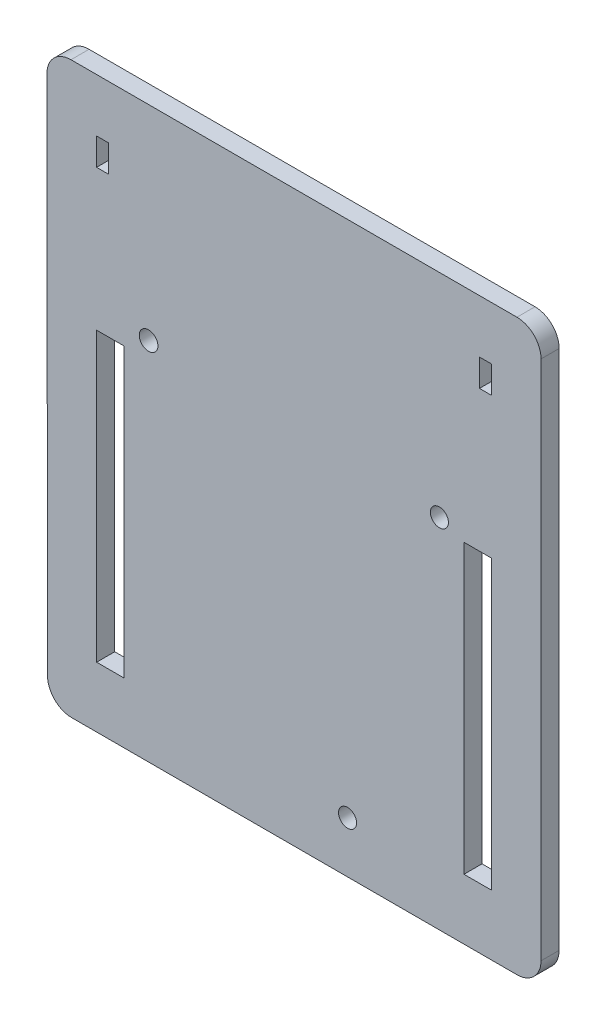
ISO-10303-21;
HEADER;
FILE_DESCRIPTION(('STEP AP214'),'2;1');
FILE_NAME('part.step','',(''),(''),'','','');
FILE_SCHEMA(('AUTOMOTIVE_DESIGN { 1 0 10303 214 1 1 1 1 }'));
ENDSEC;
DATA;
#1=APPLICATION_CONTEXT('core data for automotive mechanical design processes');
#2=APPLICATION_PROTOCOL_DEFINITION('international standard','automotive_design',2000,#1);
#3=PRODUCT_CONTEXT('',#1,'mechanical');
#4=PRODUCT('Part','Part','',(#3));
#5=PRODUCT_RELATED_PRODUCT_CATEGORY('part','',(#4));
#6=PRODUCT_DEFINITION_FORMATION('','',#4);
#7=PRODUCT_DEFINITION_CONTEXT('part definition',#1,'design');
#8=PRODUCT_DEFINITION('design','',#6,#7);
#9=PRODUCT_DEFINITION_SHAPE('','',#8);
#10=(LENGTH_UNIT() NAMED_UNIT(*) SI_UNIT(.MILLI.,.METRE.));
#11=(NAMED_UNIT(*) PLANE_ANGLE_UNIT() SI_UNIT($,.RADIAN.));
#12=(NAMED_UNIT(*) SI_UNIT($,.STERADIAN.) SOLID_ANGLE_UNIT());
#13=UNCERTAINTY_MEASURE_WITH_UNIT(LENGTH_MEASURE(1.E-05),#10,'distance_accuracy_value','');
#14=(GEOMETRIC_REPRESENTATION_CONTEXT(3) GLOBAL_UNCERTAINTY_ASSIGNED_CONTEXT((#13)) GLOBAL_UNIT_ASSIGNED_CONTEXT((#10,
#11,#12)) REPRESENTATION_CONTEXT('',''));
#15=CARTESIAN_POINT('',(0.,0.,0.));
#16=DIRECTION('',(0.,0.,1.));
#17=DIRECTION('',(1.,0.,0.));
#18=AXIS2_PLACEMENT_3D('',#15,#16,#17);
#19=CARTESIAN_POINT('',(0.,0.,3.));
#20=DIRECTION('',(0.,0.,-1.));
#21=DIRECTION('',(-1.,0.,0.));
#22=AXIS2_PLACEMENT_3D('',#19,#20,#21);
#23=PLANE('',#22);
#24=DIRECTION('',(0.,-1.,0.));
#25=VECTOR('',#24,1.);
#26=CARTESIAN_POINT('',(28.2163465132615,51.76,3.));
#27=LINE('',#26,#25);
#28=CARTESIAN_POINT('',(28.2163465132615,51.76,3.));
#29=VERTEX_POINT('',#28);
#30=CARTESIAN_POINT('',(28.2163465132615,4.04,3.));
#31=VERTEX_POINT('',#30);
#32=EDGE_CURVE('E237',#29,#31,#27,.T.);
#33=ORIENTED_EDGE('',*,*,#32,.F.);
#34=DIRECTION('',(-1.,0.,0.));
#35=VECTOR('',#34,1.);
#36=CARTESIAN_POINT('',(28.2163465132615,51.76,3.));
#37=LINE('',#36,#35);
#38=CARTESIAN_POINT('',(32.7563465132615,51.76,3.));
#39=VERTEX_POINT('',#38);
#40=EDGE_CURVE('E245',#39,#29,#37,.T.);
#41=ORIENTED_EDGE('',*,*,#40,.F.);
#42=DIRECTION('',(0.,1.,0.));
#43=VECTOR('',#42,1.);
#44=CARTESIAN_POINT('',(32.7563465132615,51.76,3.));
#45=LINE('',#44,#43);
#46=CARTESIAN_POINT('',(32.7563465132615,4.04,3.));
#47=VERTEX_POINT('',#46);
#48=EDGE_CURVE('E242',#47,#39,#45,.T.);
#49=ORIENTED_EDGE('',*,*,#48,.F.);
#50=DIRECTION('',(1.,0.,0.));
#51=VECTOR('',#50,1.);
#52=CARTESIAN_POINT('',(28.2163465132615,4.04,3.));
#53=LINE('',#52,#51);
#54=EDGE_CURVE('E239',#31,#47,#53,.T.);
#55=ORIENTED_EDGE('',*,*,#54,.F.);
#56=EDGE_LOOP('',(#33,#41,#49,#55));
#57=FACE_BOUND('',#56,.T.);
#58=DIRECTION('',(0.,-1.,0.));
#59=VECTOR('',#58,1.);
#60=CARTESIAN_POINT('',(-32.7436534867386,51.76,3.));
#61=LINE('',#60,#59);
#62=CARTESIAN_POINT('',(-32.7436534867386,51.76,3.));
#63=VERTEX_POINT('',#62);
#64=CARTESIAN_POINT('',(-32.7436534867385,4.03999999999999,3.));
#65=VERTEX_POINT('',#64);
#66=EDGE_CURVE('E317',#63,#65,#61,.T.);
#67=ORIENTED_EDGE('',*,*,#66,.F.);
#68=DIRECTION('',(-1.,0.,0.));
#69=VECTOR('',#68,1.);
#70=CARTESIAN_POINT('',(-32.7436534867386,51.76,3.));
#71=LINE('',#70,#69);
#72=CARTESIAN_POINT('',(-28.2036534867385,51.76,3.));
#73=VERTEX_POINT('',#72);
#74=EDGE_CURVE('E325',#73,#63,#71,.T.);
#75=ORIENTED_EDGE('',*,*,#74,.F.);
#76=DIRECTION('',(0.,1.,0.));
#77=VECTOR('',#76,1.);
#78=CARTESIAN_POINT('',(-28.2036534867385,51.76,3.));
#79=LINE('',#78,#77);
#80=CARTESIAN_POINT('',(-28.2036534867385,4.03999999999999,3.));
#81=VERTEX_POINT('',#80);
#82=EDGE_CURVE('E322',#81,#73,#79,.T.);
#83=ORIENTED_EDGE('',*,*,#82,.F.);
#84=DIRECTION('',(1.,0.,0.));
#85=VECTOR('',#84,1.);
#86=CARTESIAN_POINT('',(-32.7436534867385,4.03999999999999,3.));
#87=LINE('',#86,#85);
#88=EDGE_CURVE('E319',#65,#81,#87,.T.);
#89=ORIENTED_EDGE('',*,*,#88,.F.);
#90=EDGE_LOOP('',(#67,#75,#83,#89));
#91=FACE_BOUND('',#90,.T.);
#92=DIRECTION('',(0.,1.,0.));
#93=VECTOR('',#92,1.);
#94=CARTESIAN_POINT('',(41.0063465132615,-6.,3.));
#95=LINE('',#94,#93);
#96=CARTESIAN_POINT('',(41.0063465132615,-2.,3.));
#97=VERTEX_POINT('',#96);
#98=CARTESIAN_POINT('',(41.0063465132615,84.5,3.));
#99=VERTEX_POINT('',#98);
#100=EDGE_CURVE('E353',#97,#99,#95,.T.);
#101=ORIENTED_EDGE('',*,*,#100,.T.);
#102=CARTESIAN_POINT('',(37.0063465132615,84.5,3.));
#103=DIRECTION('',(0.,0.,-1.));
#104=DIRECTION('',(-1.,0.,0.));
#105=AXIS2_PLACEMENT_3D('',#102,#103,#104);
#106=CIRCLE('',#105,4.);
#107=CARTESIAN_POINT('',(37.0063465132615,88.5,3.));
#108=VERTEX_POINT('',#107);
#109=EDGE_CURVE('E391',#99,#108,#106,.F.);
#110=ORIENTED_EDGE('',*,*,#109,.T.);
#111=DIRECTION('',(-1.,0.,0.));
#112=VECTOR('',#111,1.);
#113=CARTESIAN_POINT('',(-41.0063465132615,88.5,3.));
#114=LINE('',#113,#112);
#115=CARTESIAN_POINT('',(-37.0011654980416,88.5,3.));
#116=VERTEX_POINT('',#115);
#117=EDGE_CURVE('E356',#108,#116,#114,.T.);
#118=ORIENTED_EDGE('',*,*,#117,.T.);
#119=CARTESIAN_POINT('',(-37.0011654980416,84.5,3.));
#120=DIRECTION('',(0.,0.,-1.));
#121=DIRECTION('',(-1.,0.,0.));
#122=AXIS2_PLACEMENT_3D('',#119,#120,#121);
#123=CIRCLE('',#122,4.);
#124=CARTESIAN_POINT('',(-41.00116214702,84.4948223401421,3.));
#125=VERTEX_POINT('',#124);
#126=EDGE_CURVE('E386',#116,#125,#123,.F.);
#127=ORIENTED_EDGE('',*,*,#126,.T.);
#128=DIRECTION('',(0.00129441496447232,-0.999999162244599,0.));
#129=VECTOR('',#128,1.);
#130=CARTESIAN_POINT('',(-40.8840241966427,-6.00000000000001,3.));
#131=LINE('',#130,#129);
#132=CARTESIAN_POINT('',(-40.8891951587921,-2.0051776598579,3.));
#133=VERTEX_POINT('',#132);
#134=EDGE_CURVE('E348',#125,#133,#131,.T.);
#135=ORIENTED_EDGE('',*,*,#134,.T.);
#136=CARTESIAN_POINT('',(-36.8891985098138,-2.00000000000001,3.));
#137=DIRECTION('',(0.,0.,-1.));
#138=DIRECTION('',(-1.,0.,0.));
#139=AXIS2_PLACEMENT_3D('',#136,#137,#138);
#140=CIRCLE('',#139,4.);
#141=CARTESIAN_POINT('',(-36.8891985098138,-6.00000000000001,3.));
#142=VERTEX_POINT('',#141);
#143=EDGE_CURVE('E55',#133,#142,#140,.F.);
#144=ORIENTED_EDGE('',*,*,#143,.T.);
#145=DIRECTION('',(1.,0.,0.));
#146=VECTOR('',#145,1.);
#147=CARTESIAN_POINT('',(-40.8840241966427,-6.00000000000001,3.));
#148=LINE('',#147,#146);
#149=CARTESIAN_POINT('',(37.0063465132614,-6.,3.));
#150=VERTEX_POINT('',#149);
#151=EDGE_CURVE('E350',#142,#150,#148,.T.);
#152=ORIENTED_EDGE('',*,*,#151,.T.);
#153=CARTESIAN_POINT('',(37.0063465132615,-2.,3.));
#154=DIRECTION('',(0.,0.,-1.));
#155=DIRECTION('',(-1.,0.,0.));
#156=AXIS2_PLACEMENT_3D('',#153,#154,#155);
#157=CIRCLE('',#156,4.);
#158=EDGE_CURVE('E389',#150,#97,#157,.F.);
#159=ORIENTED_EDGE('',*,*,#158,.T.);
#160=EDGE_LOOP('',(#101,#110,#118,#127,#135,#144,#152,#159));
#161=FACE_BOUND('',#160,.T.);
#162=DIRECTION('',(0.,1.,0.));
#163=VECTOR('',#162,1.);
#164=CARTESIAN_POINT('',(32.7563465132615,79.6656125540524,3.));
#165=LINE('',#164,#163);
#166=CARTESIAN_POINT('',(32.7563465132615,75.1570048197413,3.));
#167=VERTEX_POINT('',#166);
#168=CARTESIAN_POINT('',(32.7563465132615,79.6656125540524,3.));
#169=VERTEX_POINT('',#168);
#170=EDGE_CURVE('E286',#167,#169,#165,.T.);
#171=ORIENTED_EDGE('',*,*,#170,.F.);
#172=DIRECTION('',(1.,0.,0.));
#173=VECTOR('',#172,1.);
#174=CARTESIAN_POINT('',(32.7563465132615,75.1570048197413,3.));
#175=LINE('',#174,#173);
#176=CARTESIAN_POINT('',(30.790733959209,75.1570048197413,3.));
#177=VERTEX_POINT('',#176);
#178=EDGE_CURVE('E294',#177,#167,#175,.T.);
#179=ORIENTED_EDGE('',*,*,#178,.F.);
#180=DIRECTION('',(0.,-1.,0.));
#181=VECTOR('',#180,1.);
#182=CARTESIAN_POINT('',(30.790733959209,79.6656125540524,3.));
#183=LINE('',#182,#181);
#184=CARTESIAN_POINT('',(30.790733959209,79.6656125540524,3.));
#185=VERTEX_POINT('',#184);
#186=EDGE_CURVE('E291',#185,#177,#183,.T.);
#187=ORIENTED_EDGE('',*,*,#186,.F.);
#188=DIRECTION('',(-1.,0.,0.));
#189=VECTOR('',#188,1.);
#190=CARTESIAN_POINT('',(32.7563465132615,79.6656125540524,3.));
#191=LINE('',#190,#189);
#192=EDGE_CURVE('E288',#169,#185,#191,.T.);
#193=ORIENTED_EDGE('',*,*,#192,.F.);
#194=EDGE_LOOP('',(#171,#179,#187,#193));
#195=FACE_BOUND('',#194,.T.);
#196=CARTESIAN_POINT('',(-24.1236534867385,54.57,3.));
#197=DIRECTION('',(0.,0.,1.));
#198=DIRECTION('',(1.,0.,0.));
#199=AXIS2_PLACEMENT_3D('',#196,#197,#198);
#200=CIRCLE('',#199,1.54889262502124);
#201=CARTESIAN_POINT('',(-22.5747608617173,54.57,3.));
#202=VERTEX_POINT('',#201);
#203=EDGE_CURVE('E280',#202,#202,#200,.T.);
#204=ORIENTED_EDGE('',*,*,#203,.F.);
#205=EDGE_LOOP('',(#204));
#206=FACE_BOUND('',#205,.T.);
#207=CARTESIAN_POINT('',(24.1363465132615,53.3,3.));
#208=DIRECTION('',(0.,0.,1.));
#209=DIRECTION('',(1.,0.,0.));
#210=AXIS2_PLACEMENT_3D('',#207,#208,#209);
#211=CIRCLE('',#210,1.5);
#212=CARTESIAN_POINT('',(25.6363465132615,53.3,3.));
#213=VERTEX_POINT('',#212);
#214=EDGE_CURVE('E274',#213,#213,#211,.T.);
#215=ORIENTED_EDGE('',*,*,#214,.F.);
#216=EDGE_LOOP('',(#215));
#217=FACE_BOUND('',#216,.T.);
#218=CARTESIAN_POINT('',(8.89634651326147,2.49999999999999,3.));
#219=DIRECTION('',(0.,0.,1.));
#220=DIRECTION('',(1.,0.,0.));
#221=AXIS2_PLACEMENT_3D('',#218,#219,#220);
#222=CIRCLE('',#221,1.5);
#223=CARTESIAN_POINT('',(10.3963465132615,2.49999999999999,3.));
#224=VERTEX_POINT('',#223);
#225=EDGE_CURVE('E268',#224,#224,#222,.T.);
#226=ORIENTED_EDGE('',*,*,#225,.F.);
#227=EDGE_LOOP('',(#226));
#228=FACE_BOUND('',#227,.T.);
#229=DIRECTION('',(0.,-1.,0.));
#230=VECTOR('',#229,1.);
#231=CARTESIAN_POINT('',(-32.7563465132615,79.6656125540524,3.));
#232=LINE('',#231,#230);
#233=CARTESIAN_POINT('',(-32.7563465132615,79.6656125540524,3.));
#234=VERTEX_POINT('',#233);
#235=CARTESIAN_POINT('',(-32.7563465132615,75.1570048197413,3.));
#236=VERTEX_POINT('',#235);
#237=EDGE_CURVE('E196',#234,#236,#232,.T.);
#238=ORIENTED_EDGE('',*,*,#237,.F.);
#239=DIRECTION('',(-1.,0.,0.));
#240=VECTOR('',#239,1.);
#241=CARTESIAN_POINT('',(-32.7563465132615,79.6656125540524,3.));
#242=LINE('',#241,#240);
#243=CARTESIAN_POINT('',(-30.790733959209,79.6656125540524,3.));
#244=VERTEX_POINT('',#243);
#245=EDGE_CURVE('E221',#244,#234,#242,.T.);
#246=ORIENTED_EDGE('',*,*,#245,.F.);
#247=DIRECTION('',(0.,1.,0.));
#248=VECTOR('',#247,1.);
#249=CARTESIAN_POINT('',(-30.790733959209,79.6656125540524,3.));
#250=LINE('',#249,#248);
#251=CARTESIAN_POINT('',(-30.790733959209,75.1570048197413,3.));
#252=VERTEX_POINT('',#251);
#253=EDGE_CURVE('E219',#252,#244,#250,.T.);
#254=ORIENTED_EDGE('',*,*,#253,.F.);
#255=DIRECTION('',(1.,0.,0.));
#256=VECTOR('',#255,1.);
#257=CARTESIAN_POINT('',(-32.7563465132615,75.1570048197413,3.));
#258=LINE('',#257,#256);
#259=EDGE_CURVE('E206',#236,#252,#258,.T.);
#260=ORIENTED_EDGE('',*,*,#259,.F.);
#261=EDGE_LOOP('',(#238,#246,#254,#260));
#262=FACE_BOUND('',#261,.T.);
#263=ADVANCED_FACE('F33',(#57,#91,#161,#195,#206,#217,#228,#262),#23,.F.);
#264=CARTESIAN_POINT('',(0.,0.,0.));
#265=DIRECTION('',(0.,0.,-1.));
#266=DIRECTION('',(-1.,0.,0.));
#267=AXIS2_PLACEMENT_3D('',#264,#265,#266);
#268=PLANE('',#267);
#269=CARTESIAN_POINT('',(24.1363465132615,53.3,0.));
#270=DIRECTION('',(0.,0.,1.));
#271=DIRECTION('',(1.,0.,0.));
#272=AXIS2_PLACEMENT_3D('',#269,#270,#271);
#273=CIRCLE('',#272,1.5);
#274=CARTESIAN_POINT('',(25.6363465132615,53.3,0.));
#275=VERTEX_POINT('',#274);
#276=EDGE_CURVE('E271',#275,#275,#273,.T.);
#277=ORIENTED_EDGE('',*,*,#276,.T.);
#278=EDGE_LOOP('',(#277));
#279=FACE_BOUND('',#278,.T.);
#280=DIRECTION('',(1.,0.,0.));
#281=VECTOR('',#280,1.);
#282=CARTESIAN_POINT('',(32.7563465132615,75.1570048197413,0.));
#283=LINE('',#282,#281);
#284=CARTESIAN_POINT('',(30.790733959209,75.1570048197413,0.));
#285=VERTEX_POINT('',#284);
#286=CARTESIAN_POINT('',(32.7563465132615,75.1570048197413,0.));
#287=VERTEX_POINT('',#286);
#288=EDGE_CURVE('E289',#285,#287,#283,.T.);
#289=ORIENTED_EDGE('',*,*,#288,.T.);
#290=DIRECTION('',(0.,1.,0.));
#291=VECTOR('',#290,1.);
#292=CARTESIAN_POINT('',(32.7563465132615,79.6656125540524,0.));
#293=LINE('',#292,#291);
#294=CARTESIAN_POINT('',(32.7563465132615,79.6656125540524,0.));
#295=VERTEX_POINT('',#294);
#296=EDGE_CURVE('E283',#287,#295,#293,.T.);
#297=ORIENTED_EDGE('',*,*,#296,.T.);
#298=DIRECTION('',(-1.,0.,0.));
#299=VECTOR('',#298,1.);
#300=CARTESIAN_POINT('',(32.7563465132615,79.6656125540524,0.));
#301=LINE('',#300,#299);
#302=CARTESIAN_POINT('',(30.790733959209,79.6656125540524,0.));
#303=VERTEX_POINT('',#302);
#304=EDGE_CURVE('E299',#295,#303,#301,.T.);
#305=ORIENTED_EDGE('',*,*,#304,.T.);
#306=DIRECTION('',(0.,-1.,0.));
#307=VECTOR('',#306,1.);
#308=CARTESIAN_POINT('',(30.790733959209,79.6656125540524,0.));
#309=LINE('',#308,#307);
#310=EDGE_CURVE('E302',#303,#285,#309,.T.);
#311=ORIENTED_EDGE('',*,*,#310,.T.);
#312=EDGE_LOOP('',(#289,#297,#305,#311));
#313=FACE_BOUND('',#312,.T.);
#314=DIRECTION('',(-1.,0.,0.));
#315=VECTOR('',#314,1.);
#316=CARTESIAN_POINT('',(-32.7436534867386,51.76,0.));
#317=LINE('',#316,#315);
#318=CARTESIAN_POINT('',(-28.2036534867385,51.76,0.));
#319=VERTEX_POINT('',#318);
#320=CARTESIAN_POINT('',(-32.7436534867386,51.76,0.));
#321=VERTEX_POINT('',#320);
#322=EDGE_CURVE('E320',#319,#321,#317,.T.);
#323=ORIENTED_EDGE('',*,*,#322,.T.);
#324=DIRECTION('',(0.,-1.,0.));
#325=VECTOR('',#324,1.);
#326=CARTESIAN_POINT('',(-32.7436534867386,51.76,0.));
#327=LINE('',#326,#325);
#328=CARTESIAN_POINT('',(-32.7436534867385,4.03999999999999,0.));
#329=VERTEX_POINT('',#328);
#330=EDGE_CURVE('E316',#321,#329,#327,.T.);
#331=ORIENTED_EDGE('',*,*,#330,.T.);
#332=DIRECTION('',(1.,0.,0.));
#333=VECTOR('',#332,1.);
#334=CARTESIAN_POINT('',(-32.7436534867385,4.03999999999999,0.));
#335=LINE('',#334,#333);
#336=CARTESIAN_POINT('',(-28.2036534867385,4.03999999999999,0.));
#337=VERTEX_POINT('',#336);
#338=EDGE_CURVE('E330',#329,#337,#335,.T.);
#339=ORIENTED_EDGE('',*,*,#338,.T.);
#340=DIRECTION('',(0.,1.,0.));
#341=VECTOR('',#340,1.);
#342=CARTESIAN_POINT('',(-28.2036534867385,51.76,0.));
#343=LINE('',#342,#341);
#344=EDGE_CURVE('E333',#337,#319,#343,.T.);
#345=ORIENTED_EDGE('',*,*,#344,.T.);
#346=EDGE_LOOP('',(#323,#331,#339,#345));
#347=FACE_BOUND('',#346,.T.);
#348=DIRECTION('',(-1.,0.,0.));
#349=VECTOR('',#348,1.);
#350=CARTESIAN_POINT('',(-41.0063465132615,88.5,0.));
#351=LINE('',#350,#349);
#352=CARTESIAN_POINT('',(37.0063465132615,88.5,0.));
#353=VERTEX_POINT('',#352);
#354=CARTESIAN_POINT('',(-37.0011654980416,88.5,0.));
#355=VERTEX_POINT('',#354);
#356=EDGE_CURVE('E351',#353,#355,#351,.T.);
#357=ORIENTED_EDGE('',*,*,#356,.F.);
#358=CARTESIAN_POINT('',(37.0063465132615,84.5,0.));
#359=DIRECTION('',(0.,0.,-1.));
#360=DIRECTION('',(-1.,0.,0.));
#361=AXIS2_PLACEMENT_3D('',#358,#359,#360);
#362=CIRCLE('',#361,4.);
#363=CARTESIAN_POINT('',(41.0063465132615,84.5,0.));
#364=VERTEX_POINT('',#363);
#365=EDGE_CURVE('E379',#353,#364,#362,.T.);
#366=ORIENTED_EDGE('',*,*,#365,.T.);
#367=DIRECTION('',(0.,1.,0.));
#368=VECTOR('',#367,1.);
#369=CARTESIAN_POINT('',(41.0063465132615,-6.,0.));
#370=LINE('',#369,#368);
#371=CARTESIAN_POINT('',(41.0063465132615,-2.,0.));
#372=VERTEX_POINT('',#371);
#373=EDGE_CURVE('E364',#372,#364,#370,.T.);
#374=ORIENTED_EDGE('',*,*,#373,.F.);
#375=CARTESIAN_POINT('',(37.0063465132615,-2.,0.));
#376=DIRECTION('',(0.,0.,-1.));
#377=DIRECTION('',(-1.,0.,0.));
#378=AXIS2_PLACEMENT_3D('',#375,#376,#377);
#379=CIRCLE('',#378,4.);
#380=CARTESIAN_POINT('',(37.0063465132614,-6.,0.));
#381=VERTEX_POINT('',#380);
#382=EDGE_CURVE('E377',#372,#381,#379,.T.);
#383=ORIENTED_EDGE('',*,*,#382,.T.);
#384=DIRECTION('',(1.,0.,0.));
#385=VECTOR('',#384,1.);
#386=CARTESIAN_POINT('',(-40.8840241966427,-6.00000000000001,0.));
#387=LINE('',#386,#385);
#388=CARTESIAN_POINT('',(-36.8891985098138,-6.00000000000001,0.));
#389=VERTEX_POINT('',#388);
#390=EDGE_CURVE('E362',#389,#381,#387,.T.);
#391=ORIENTED_EDGE('',*,*,#390,.F.);
#392=CARTESIAN_POINT('',(-36.8891985098138,-2.00000000000001,0.));
#393=DIRECTION('',(0.,0.,-1.));
#394=DIRECTION('',(-1.,0.,0.));
#395=AXIS2_PLACEMENT_3D('',#392,#393,#394);
#396=CIRCLE('',#395,4.);
#397=CARTESIAN_POINT('',(-40.8891951587921,-2.0051776598579,0.));
#398=VERTEX_POINT('',#397);
#399=EDGE_CURVE('E375',#389,#398,#396,.T.);
#400=ORIENTED_EDGE('',*,*,#399,.T.);
#401=DIRECTION('',(0.00129441496447232,-0.999999162244599,0.));
#402=VECTOR('',#401,1.);
#403=CARTESIAN_POINT('',(-40.8840241966427,-6.00000000000001,0.));
#404=LINE('',#403,#402);
#405=CARTESIAN_POINT('',(-41.00116214702,84.4948223401421,0.));
#406=VERTEX_POINT('',#405);
#407=EDGE_CURVE('E347',#406,#398,#404,.T.);
#408=ORIENTED_EDGE('',*,*,#407,.F.);
#409=CARTESIAN_POINT('',(-37.0011654980416,84.5,0.));
#410=DIRECTION('',(0.,0.,-1.));
#411=DIRECTION('',(-1.,0.,0.));
#412=AXIS2_PLACEMENT_3D('',#409,#410,#411);
#413=CIRCLE('',#412,4.);
#414=EDGE_CURVE('E373',#406,#355,#413,.T.);
#415=ORIENTED_EDGE('',*,*,#414,.T.);
#416=EDGE_LOOP('',(#357,#366,#374,#383,#391,#400,#408,#415));
#417=FACE_BOUND('',#416,.T.);
#418=CARTESIAN_POINT('',(-24.1236534867385,54.57,0.));
#419=DIRECTION('',(0.,0.,1.));
#420=DIRECTION('',(1.,0.,0.));
#421=AXIS2_PLACEMENT_3D('',#418,#419,#420);
#422=CIRCLE('',#421,1.54889262502124);
#423=CARTESIAN_POINT('',(-22.5747608617173,54.57,0.));
#424=VERTEX_POINT('',#423);
#425=EDGE_CURVE('E277',#424,#424,#422,.T.);
#426=ORIENTED_EDGE('',*,*,#425,.T.);
#427=EDGE_LOOP('',(#426));
#428=FACE_BOUND('',#427,.T.);
#429=CARTESIAN_POINT('',(8.89634651326147,2.49999999999999,0.));
#430=DIRECTION('',(0.,0.,1.));
#431=DIRECTION('',(1.,0.,0.));
#432=AXIS2_PLACEMENT_3D('',#429,#430,#431);
#433=CIRCLE('',#432,1.5);
#434=CARTESIAN_POINT('',(10.3963465132615,2.49999999999999,0.));
#435=VERTEX_POINT('',#434);
#436=EDGE_CURVE('E267',#435,#435,#433,.T.);
#437=ORIENTED_EDGE('',*,*,#436,.T.);
#438=EDGE_LOOP('',(#437));
#439=FACE_BOUND('',#438,.T.);
#440=DIRECTION('',(-1.,0.,0.));
#441=VECTOR('',#440,1.);
#442=CARTESIAN_POINT('',(28.2163465132615,51.76,0.));
#443=LINE('',#442,#441);
#444=CARTESIAN_POINT('',(32.7563465132615,51.76,0.));
#445=VERTEX_POINT('',#444);
#446=CARTESIAN_POINT('',(28.2163465132615,51.76,0.));
#447=VERTEX_POINT('',#446);
#448=EDGE_CURVE('E240',#445,#447,#443,.T.);
#449=ORIENTED_EDGE('',*,*,#448,.T.);
#450=DIRECTION('',(0.,-1.,0.));
#451=VECTOR('',#450,1.);
#452=CARTESIAN_POINT('',(28.2163465132615,51.76,0.));
#453=LINE('',#452,#451);
#454=CARTESIAN_POINT('',(28.2163465132615,4.04,0.));
#455=VERTEX_POINT('',#454);
#456=EDGE_CURVE('E214',#447,#455,#453,.T.);
#457=ORIENTED_EDGE('',*,*,#456,.T.);
#458=DIRECTION('',(1.,0.,0.));
#459=VECTOR('',#458,1.);
#460=CARTESIAN_POINT('',(28.2163465132615,4.04,0.));
#461=LINE('',#460,#459);
#462=CARTESIAN_POINT('',(32.7563465132615,4.04,0.));
#463=VERTEX_POINT('',#462);
#464=EDGE_CURVE('E250',#455,#463,#461,.T.);
#465=ORIENTED_EDGE('',*,*,#464,.T.);
#466=DIRECTION('',(0.,1.,0.));
#467=VECTOR('',#466,1.);
#468=CARTESIAN_POINT('',(32.7563465132615,51.76,0.));
#469=LINE('',#468,#467);
#470=EDGE_CURVE('E253',#463,#445,#469,.T.);
#471=ORIENTED_EDGE('',*,*,#470,.T.);
#472=EDGE_LOOP('',(#449,#457,#465,#471));
#473=FACE_BOUND('',#472,.T.);
#474=DIRECTION('',(-1.,0.,0.));
#475=VECTOR('',#474,1.);
#476=CARTESIAN_POINT('',(-32.7563465132615,79.6656125540524,0.));
#477=LINE('',#476,#475);
#478=CARTESIAN_POINT('',(-30.790733959209,79.6656125540524,0.));
#479=VERTEX_POINT('',#478);
#480=CARTESIAN_POINT('',(-32.7563465132615,79.6656125540524,0.));
#481=VERTEX_POINT('',#480);
#482=EDGE_CURVE('E207',#479,#481,#477,.T.);
#483=ORIENTED_EDGE('',*,*,#482,.T.);
#484=DIRECTION('',(0.,-1.,0.));
#485=VECTOR('',#484,1.);
#486=CARTESIAN_POINT('',(-32.7563465132615,79.6656125540524,0.));
#487=LINE('',#486,#485);
#488=CARTESIAN_POINT('',(-32.7563465132615,75.1570048197413,0.));
#489=VERTEX_POINT('',#488);
#490=EDGE_CURVE('E225',#481,#489,#487,.T.);
#491=ORIENTED_EDGE('',*,*,#490,.T.);
#492=DIRECTION('',(1.,0.,0.));
#493=VECTOR('',#492,1.);
#494=CARTESIAN_POINT('',(-32.7563465132615,75.1570048197413,0.));
#495=LINE('',#494,#493);
#496=CARTESIAN_POINT('',(-30.790733959209,75.1570048197413,0.));
#497=VERTEX_POINT('',#496);
#498=EDGE_CURVE('E213',#489,#497,#495,.T.);
#499=ORIENTED_EDGE('',*,*,#498,.T.);
#500=DIRECTION('',(0.,1.,0.));
#501=VECTOR('',#500,1.);
#502=CARTESIAN_POINT('',(-30.790733959209,79.6656125540524,0.));
#503=LINE('',#502,#501);
#504=EDGE_CURVE('E228',#497,#479,#503,.T.);
#505=ORIENTED_EDGE('',*,*,#504,.T.);
#506=EDGE_LOOP('',(#483,#491,#499,#505));
#507=FACE_BOUND('',#506,.T.);
#508=ADVANCED_FACE('F407',(#279,#313,#347,#417,#428,#439,#473,#507),#268,.T.);
#509=CARTESIAN_POINT('',(-40.8840241966427,-6.00000000000001,3.));
#510=DIRECTION('',(0.999999162244599,0.00129441496447232,0.));
#511=DIRECTION('',(-0.00129441496447232,0.999999162244599,0.));
#512=AXIS2_PLACEMENT_3D('',#509,#510,#511);
#513=PLANE('',#512);
#514=ORIENTED_EDGE('',*,*,#407,.T.);
#515=DIRECTION('',(0.,0.,-1.));
#516=VECTOR('',#515,1.);
#517=CARTESIAN_POINT('',(-40.8891951587921,-2.0051776598579,3.));
#518=LINE('',#517,#516);
#519=EDGE_CURVE('E11',#398,#133,#518,.F.);
#520=ORIENTED_EDGE('',*,*,#519,.T.);
#521=ORIENTED_EDGE('',*,*,#134,.F.);
#522=DIRECTION('',(0.,0.,-1.));
#523=VECTOR('',#522,1.);
#524=CARTESIAN_POINT('',(-41.00116214702,84.4948223401421,3.));
#525=LINE('',#524,#523);
#526=EDGE_CURVE('E41',#125,#406,#525,.T.);
#527=ORIENTED_EDGE('',*,*,#526,.T.);
#528=EDGE_LOOP('',(#514,#520,#521,#527));
#529=FACE_BOUND('',#528,.T.);
#530=ADVANCED_FACE('F401',(#529),#513,.F.);
#531=CARTESIAN_POINT('',(-40.8840241966427,-6.00000000000001,3.));
#532=DIRECTION('',(0.,1.,0.));
#533=DIRECTION('',(-1.,0.,0.));
#534=AXIS2_PLACEMENT_3D('',#531,#532,#533);
#535=PLANE('',#534);
#536=ORIENTED_EDGE('',*,*,#390,.T.);
#537=DIRECTION('',(0.,0.,-1.));
#538=VECTOR('',#537,1.);
#539=CARTESIAN_POINT('',(37.0063465132615,-6.,3.));
#540=LINE('',#539,#538);
#541=EDGE_CURVE('E48',#381,#150,#540,.F.);
#542=ORIENTED_EDGE('',*,*,#541,.T.);
#543=ORIENTED_EDGE('',*,*,#151,.F.);
#544=DIRECTION('',(0.,0.,-1.));
#545=VECTOR('',#544,1.);
#546=CARTESIAN_POINT('',(-36.8891985098138,-6.00000000000001,3.));
#547=LINE('',#546,#545);
#548=EDGE_CURVE('E393',#142,#389,#547,.T.);
#549=ORIENTED_EDGE('',*,*,#548,.T.);
#550=EDGE_LOOP('',(#536,#542,#543,#549));
#551=FACE_BOUND('',#550,.T.);
#552=ADVANCED_FACE('F413',(#551),#535,.F.);
#553=CARTESIAN_POINT('',(41.0063465132615,-6.,3.));
#554=DIRECTION('',(-1.,0.,0.));
#555=DIRECTION('',(0.,0.,1.));
#556=AXIS2_PLACEMENT_3D('',#553,#554,#555);
#557=PLANE('',#556);
#558=ORIENTED_EDGE('',*,*,#373,.T.);
#559=DIRECTION('',(0.,0.,-1.));
#560=VECTOR('',#559,1.);
#561=CARTESIAN_POINT('',(41.0063465132615,84.5,3.));
#562=LINE('',#561,#560);
#563=EDGE_CURVE('E384',#364,#99,#562,.F.);
#564=ORIENTED_EDGE('',*,*,#563,.T.);
#565=ORIENTED_EDGE('',*,*,#100,.F.);
#566=DIRECTION('',(0.,0.,-1.));
#567=VECTOR('',#566,1.);
#568=CARTESIAN_POINT('',(41.0063465132615,-2.,3.));
#569=LINE('',#568,#567);
#570=EDGE_CURVE('E381',#97,#372,#569,.T.);
#571=ORIENTED_EDGE('',*,*,#570,.T.);
#572=EDGE_LOOP('',(#558,#564,#565,#571));
#573=FACE_BOUND('',#572,.T.);
#574=ADVANCED_FACE('F422',(#573),#557,.F.);
#575=CARTESIAN_POINT('',(-41.0063465132615,88.5,3.));
#576=DIRECTION('',(0.,-1.,0.));
#577=DIRECTION('',(1.,0.,0.));
#578=AXIS2_PLACEMENT_3D('',#575,#576,#577);
#579=PLANE('',#578);
#580=ORIENTED_EDGE('',*,*,#117,.F.);
#581=DIRECTION('',(0.,0.,-1.));
#582=VECTOR('',#581,1.);
#583=CARTESIAN_POINT('',(37.0063465132615,88.5,3.));
#584=LINE('',#583,#582);
#585=EDGE_CURVE('E370',#108,#353,#584,.T.);
#586=ORIENTED_EDGE('',*,*,#585,.T.);
#587=ORIENTED_EDGE('',*,*,#356,.T.);
#588=DIRECTION('',(0.,0.,-1.));
#589=VECTOR('',#588,1.);
#590=CARTESIAN_POINT('',(-37.0011654980416,88.5,3.));
#591=LINE('',#590,#589);
#592=EDGE_CURVE('E359',#355,#116,#591,.F.);
#593=ORIENTED_EDGE('',*,*,#592,.T.);
#594=EDGE_LOOP('',(#580,#586,#587,#593));
#595=FACE_BOUND('',#594,.T.);
#596=ADVANCED_FACE('F430',(#595),#579,.F.);
#597=CARTESIAN_POINT('',(-32.7436534867386,51.76,3.));
#598=DIRECTION('',(1.,0.,0.));
#599=DIRECTION('',(0.,1.,0.));
#600=AXIS2_PLACEMENT_3D('',#597,#598,#599);
#601=PLANE('',#600);
#602=ORIENTED_EDGE('',*,*,#330,.F.);
#603=DIRECTION('',(0.,0.,-1.));
#604=VECTOR('',#603,1.);
#605=CARTESIAN_POINT('',(-32.7436534867386,51.76,3.));
#606=LINE('',#605,#604);
#607=EDGE_CURVE('E327',#63,#321,#606,.T.);
#608=ORIENTED_EDGE('',*,*,#607,.F.);
#609=ORIENTED_EDGE('',*,*,#66,.T.);
#610=DIRECTION('',(0.,0.,-1.));
#611=VECTOR('',#610,1.);
#612=CARTESIAN_POINT('',(-32.7436534867385,4.03999999999999,3.));
#613=LINE('',#612,#611);
#614=EDGE_CURVE('E344',#65,#329,#613,.T.);
#615=ORIENTED_EDGE('',*,*,#614,.T.);
#616=EDGE_LOOP('',(#602,#608,#609,#615));
#617=FACE_BOUND('',#616,.T.);
#618=ADVANCED_FACE('F447',(#617),#601,.T.);
#619=CARTESIAN_POINT('',(-32.7436534867385,4.03999999999999,3.));
#620=DIRECTION('',(0.,1.,0.));
#621=DIRECTION('',(0.,0.,1.));
#622=AXIS2_PLACEMENT_3D('',#619,#620,#621);
#623=PLANE('',#622);
#624=ORIENTED_EDGE('',*,*,#338,.F.);
#625=ORIENTED_EDGE('',*,*,#614,.F.);
#626=ORIENTED_EDGE('',*,*,#88,.T.);
#627=DIRECTION('',(0.,0.,-1.));
#628=VECTOR('',#627,1.);
#629=CARTESIAN_POINT('',(-28.2036534867385,4.03999999999999,3.));
#630=LINE('',#629,#628);
#631=EDGE_CURVE('E342',#81,#337,#630,.T.);
#632=ORIENTED_EDGE('',*,*,#631,.T.);
#633=EDGE_LOOP('',(#624,#625,#626,#632));
#634=FACE_BOUND('',#633,.T.);
#635=ADVANCED_FACE('F631',(#634),#623,.T.);
#636=CARTESIAN_POINT('',(-28.2036534867385,51.76,3.));
#637=DIRECTION('',(-1.,0.,0.));
#638=DIRECTION('',(0.,-1.,0.));
#639=AXIS2_PLACEMENT_3D('',#636,#637,#638);
#640=PLANE('',#639);
#641=ORIENTED_EDGE('',*,*,#344,.F.);
#642=ORIENTED_EDGE('',*,*,#631,.F.);
#643=ORIENTED_EDGE('',*,*,#82,.T.);
#644=DIRECTION('',(0.,0.,-1.));
#645=VECTOR('',#644,1.);
#646=CARTESIAN_POINT('',(-28.2036534867385,51.76,3.));
#647=LINE('',#646,#645);
#648=EDGE_CURVE('E340',#73,#319,#647,.T.);
#649=ORIENTED_EDGE('',*,*,#648,.T.);
#650=EDGE_LOOP('',(#641,#642,#643,#649));
#651=FACE_BOUND('',#650,.T.);
#652=ADVANCED_FACE('F622',(#651),#640,.T.);
#653=CARTESIAN_POINT('',(-32.7436534867386,51.76,3.));
#654=DIRECTION('',(0.,-1.,0.));
#655=DIRECTION('',(0.,0.,-1.));
#656=AXIS2_PLACEMENT_3D('',#653,#654,#655);
#657=PLANE('',#656);
#658=ORIENTED_EDGE('',*,*,#322,.F.);
#659=ORIENTED_EDGE('',*,*,#648,.F.);
#660=ORIENTED_EDGE('',*,*,#74,.T.);
#661=ORIENTED_EDGE('',*,*,#607,.T.);
#662=EDGE_LOOP('',(#658,#659,#660,#661));
#663=FACE_BOUND('',#662,.T.);
#664=ADVANCED_FACE('F613',(#663),#657,.T.);
#665=CARTESIAN_POINT('',(32.7563465132615,79.6656125540524,3.));
#666=DIRECTION('',(-1.,0.,0.));
#667=DIRECTION('',(0.,0.,1.));
#668=AXIS2_PLACEMENT_3D('',#665,#666,#667);
#669=PLANE('',#668);
#670=ORIENTED_EDGE('',*,*,#296,.F.);
#671=DIRECTION('',(0.,0.,-1.));
#672=VECTOR('',#671,1.);
#673=CARTESIAN_POINT('',(32.7563465132615,75.1570048197413,3.));
#674=LINE('',#673,#672);
#675=EDGE_CURVE('E296',#167,#287,#674,.T.);
#676=ORIENTED_EDGE('',*,*,#675,.F.);
#677=ORIENTED_EDGE('',*,*,#170,.T.);
#678=DIRECTION('',(0.,0.,-1.));
#679=VECTOR('',#678,1.);
#680=CARTESIAN_POINT('',(32.7563465132615,79.6656125540524,3.));
#681=LINE('',#680,#679);
#682=EDGE_CURVE('E313',#169,#295,#681,.T.);
#683=ORIENTED_EDGE('',*,*,#682,.T.);
#684=EDGE_LOOP('',(#670,#676,#677,#683));
#685=FACE_BOUND('',#684,.T.);
#686=ADVANCED_FACE('F604',(#685),#669,.T.);
#687=CARTESIAN_POINT('',(32.7563465132615,79.6656125540524,3.));
#688=DIRECTION('',(0.,-1.,0.));
#689=DIRECTION('',(0.,0.,-1.));
#690=AXIS2_PLACEMENT_3D('',#687,#688,#689);
#691=PLANE('',#690);
#692=ORIENTED_EDGE('',*,*,#304,.F.);
#693=ORIENTED_EDGE('',*,*,#682,.F.);
#694=ORIENTED_EDGE('',*,*,#192,.T.);
#695=DIRECTION('',(0.,0.,-1.));
#696=VECTOR('',#695,1.);
#697=CARTESIAN_POINT('',(30.790733959209,79.6656125540524,3.));
#698=LINE('',#697,#696);
#699=EDGE_CURVE('E311',#185,#303,#698,.T.);
#700=ORIENTED_EDGE('',*,*,#699,.T.);
#701=EDGE_LOOP('',(#692,#693,#694,#700));
#702=FACE_BOUND('',#701,.T.);
#703=ADVANCED_FACE('F595',(#702),#691,.T.);
#704=CARTESIAN_POINT('',(30.790733959209,79.6656125540524,3.));
#705=DIRECTION('',(1.,0.,0.));
#706=DIRECTION('',(0.,0.,-1.));
#707=AXIS2_PLACEMENT_3D('',#704,#705,#706);
#708=PLANE('',#707);
#709=ORIENTED_EDGE('',*,*,#310,.F.);
#710=ORIENTED_EDGE('',*,*,#699,.F.);
#711=ORIENTED_EDGE('',*,*,#186,.T.);
#712=DIRECTION('',(0.,0.,-1.));
#713=VECTOR('',#712,1.);
#714=CARTESIAN_POINT('',(30.790733959209,75.1570048197413,3.));
#715=LINE('',#714,#713);
#716=EDGE_CURVE('E309',#177,#285,#715,.T.);
#717=ORIENTED_EDGE('',*,*,#716,.T.);
#718=EDGE_LOOP('',(#709,#710,#711,#717));
#719=FACE_BOUND('',#718,.T.);
#720=ADVANCED_FACE('F586',(#719),#708,.T.);
#721=CARTESIAN_POINT('',(32.7563465132615,75.1570048197413,3.));
#722=DIRECTION('',(0.,1.,0.));
#723=DIRECTION('',(0.,0.,1.));
#724=AXIS2_PLACEMENT_3D('',#721,#722,#723);
#725=PLANE('',#724);
#726=ORIENTED_EDGE('',*,*,#288,.F.);
#727=ORIENTED_EDGE('',*,*,#716,.F.);
#728=ORIENTED_EDGE('',*,*,#178,.T.);
#729=ORIENTED_EDGE('',*,*,#675,.T.);
#730=EDGE_LOOP('',(#726,#727,#728,#729));
#731=FACE_BOUND('',#730,.T.);
#732=ADVANCED_FACE('F577',(#731),#725,.T.);
#733=CARTESIAN_POINT('',(-24.1236534867385,54.57,3.));
#734=DIRECTION('',(0.,0.,-1.));
#735=DIRECTION('',(-1.,0.,0.));
#736=AXIS2_PLACEMENT_3D('',#733,#734,#735);
#737=CYLINDRICAL_SURFACE('',#736,1.54889262502124);
#738=ORIENTED_EDGE('',*,*,#203,.T.);
#739=EDGE_LOOP('',(#738));
#740=FACE_BOUND('',#739,.T.);
#741=ORIENTED_EDGE('',*,*,#425,.F.);
#742=EDGE_LOOP('',(#741));
#743=FACE_BOUND('',#742,.T.);
#744=ADVANCED_FACE('F568',(#740,#743),#737,.F.);
#745=CARTESIAN_POINT('',(24.1363465132615,53.3,3.));
#746=DIRECTION('',(0.,0.,-1.));
#747=DIRECTION('',(-1.,0.,0.));
#748=AXIS2_PLACEMENT_3D('',#745,#746,#747);
#749=CYLINDRICAL_SURFACE('',#748,1.5);
#750=ORIENTED_EDGE('',*,*,#214,.T.);
#751=EDGE_LOOP('',(#750));
#752=FACE_BOUND('',#751,.T.);
#753=ORIENTED_EDGE('',*,*,#276,.F.);
#754=EDGE_LOOP('',(#753));
#755=FACE_BOUND('',#754,.T.);
#756=ADVANCED_FACE('F559',(#752,#755),#749,.F.);
#757=CARTESIAN_POINT('',(8.89634651326147,2.49999999999999,3.));
#758=DIRECTION('',(0.,0.,-1.));
#759=DIRECTION('',(-1.,0.,0.));
#760=AXIS2_PLACEMENT_3D('',#757,#758,#759);
#761=CYLINDRICAL_SURFACE('',#760,1.5);
#762=ORIENTED_EDGE('',*,*,#225,.T.);
#763=EDGE_LOOP('',(#762));
#764=FACE_BOUND('',#763,.T.);
#765=ORIENTED_EDGE('',*,*,#436,.F.);
#766=EDGE_LOOP('',(#765));
#767=FACE_BOUND('',#766,.T.);
#768=ADVANCED_FACE('F550',(#764,#767),#761,.F.);
#769=CARTESIAN_POINT('',(28.2163465132615,51.76,3.));
#770=DIRECTION('',(1.,0.,0.));
#771=DIRECTION('',(0.,0.,-1.));
#772=AXIS2_PLACEMENT_3D('',#769,#770,#771);
#773=PLANE('',#772);
#774=ORIENTED_EDGE('',*,*,#456,.F.);
#775=DIRECTION('',(0.,0.,-1.));
#776=VECTOR('',#775,1.);
#777=CARTESIAN_POINT('',(28.2163465132615,51.76,3.));
#778=LINE('',#777,#776);
#779=EDGE_CURVE('E247',#29,#447,#778,.T.);
#780=ORIENTED_EDGE('',*,*,#779,.F.);
#781=ORIENTED_EDGE('',*,*,#32,.T.);
#782=DIRECTION('',(0.,0.,-1.));
#783=VECTOR('',#782,1.);
#784=CARTESIAN_POINT('',(28.2163465132615,4.04,3.));
#785=LINE('',#784,#783);
#786=EDGE_CURVE('E264',#31,#455,#785,.T.);
#787=ORIENTED_EDGE('',*,*,#786,.T.);
#788=EDGE_LOOP('',(#774,#780,#781,#787));
#789=FACE_BOUND('',#788,.T.);
#790=ADVANCED_FACE('F541',(#789),#773,.T.);
#791=CARTESIAN_POINT('',(28.2163465132615,4.04,3.));
#792=DIRECTION('',(0.,1.,0.));
#793=DIRECTION('',(0.,0.,1.));
#794=AXIS2_PLACEMENT_3D('',#791,#792,#793);
#795=PLANE('',#794);
#796=ORIENTED_EDGE('',*,*,#464,.F.);
#797=ORIENTED_EDGE('',*,*,#786,.F.);
#798=ORIENTED_EDGE('',*,*,#54,.T.);
#799=DIRECTION('',(0.,0.,-1.));
#800=VECTOR('',#799,1.);
#801=CARTESIAN_POINT('',(32.7563465132615,4.04,3.));
#802=LINE('',#801,#800);
#803=EDGE_CURVE('E262',#47,#463,#802,.T.);
#804=ORIENTED_EDGE('',*,*,#803,.T.);
#805=EDGE_LOOP('',(#796,#797,#798,#804));
#806=FACE_BOUND('',#805,.T.);
#807=ADVANCED_FACE('F532',(#806),#795,.T.);
#808=CARTESIAN_POINT('',(32.7563465132615,51.76,3.));
#809=DIRECTION('',(-1.,0.,0.));
#810=DIRECTION('',(0.,-1.,0.));
#811=AXIS2_PLACEMENT_3D('',#808,#809,#810);
#812=PLANE('',#811);
#813=ORIENTED_EDGE('',*,*,#470,.F.);
#814=ORIENTED_EDGE('',*,*,#803,.F.);
#815=ORIENTED_EDGE('',*,*,#48,.T.);
#816=DIRECTION('',(0.,0.,-1.));
#817=VECTOR('',#816,1.);
#818=CARTESIAN_POINT('',(32.7563465132615,51.76,3.));
#819=LINE('',#818,#817);
#820=EDGE_CURVE('E260',#39,#445,#819,.T.);
#821=ORIENTED_EDGE('',*,*,#820,.T.);
#822=EDGE_LOOP('',(#813,#814,#815,#821));
#823=FACE_BOUND('',#822,.T.);
#824=ADVANCED_FACE('F523',(#823),#812,.T.);
#825=CARTESIAN_POINT('',(28.2163465132615,51.76,3.));
#826=DIRECTION('',(0.,-1.,0.));
#827=DIRECTION('',(0.,0.,-1.));
#828=AXIS2_PLACEMENT_3D('',#825,#826,#827);
#829=PLANE('',#828);
#830=ORIENTED_EDGE('',*,*,#448,.F.);
#831=ORIENTED_EDGE('',*,*,#820,.F.);
#832=ORIENTED_EDGE('',*,*,#40,.T.);
#833=ORIENTED_EDGE('',*,*,#779,.T.);
#834=EDGE_LOOP('',(#830,#831,#832,#833));
#835=FACE_BOUND('',#834,.T.);
#836=ADVANCED_FACE('F515',(#835),#829,.T.);
#837=CARTESIAN_POINT('',(-32.7563465132615,79.6656125540524,3.));
#838=DIRECTION('',(1.,0.,0.));
#839=DIRECTION('',(0.,0.,-1.));
#840=AXIS2_PLACEMENT_3D('',#837,#838,#839);
#841=PLANE('',#840);
#842=ORIENTED_EDGE('',*,*,#490,.F.);
#843=DIRECTION('',(0.,0.,-1.));
#844=VECTOR('',#843,1.);
#845=CARTESIAN_POINT('',(-32.7563465132615,79.6656125540524,3.));
#846=LINE('',#845,#844);
#847=EDGE_CURVE('E202',#234,#481,#846,.T.);
#848=ORIENTED_EDGE('',*,*,#847,.F.);
#849=ORIENTED_EDGE('',*,*,#237,.T.);
#850=DIRECTION('',(0.,0.,-1.));
#851=VECTOR('',#850,1.);
#852=CARTESIAN_POINT('',(-32.7563465132615,75.1570048197413,3.));
#853=LINE('',#852,#851);
#854=EDGE_CURVE('E199',#236,#489,#853,.T.);
#855=ORIENTED_EDGE('',*,*,#854,.T.);
#856=EDGE_LOOP('',(#842,#848,#849,#855));
#857=FACE_BOUND('',#856,.T.);
#858=ADVANCED_FACE('F198',(#857),#841,.T.);
#859=CARTESIAN_POINT('',(-32.7563465132615,75.1570048197413,3.));
#860=DIRECTION('',(0.,1.,0.));
#861=DIRECTION('',(0.,0.,1.));
#862=AXIS2_PLACEMENT_3D('',#859,#860,#861);
#863=PLANE('',#862);
#864=ORIENTED_EDGE('',*,*,#498,.F.);
#865=ORIENTED_EDGE('',*,*,#854,.F.);
#866=ORIENTED_EDGE('',*,*,#259,.T.);
#867=DIRECTION('',(0.,0.,-1.));
#868=VECTOR('',#867,1.);
#869=CARTESIAN_POINT('',(-30.790733959209,75.1570048197413,3.));
#870=LINE('',#869,#868);
#871=EDGE_CURVE('E215',#252,#497,#870,.T.);
#872=ORIENTED_EDGE('',*,*,#871,.T.);
#873=EDGE_LOOP('',(#864,#865,#866,#872));
#874=FACE_BOUND('',#873,.T.);
#875=ADVANCED_FACE('F210',(#874),#863,.T.);
#876=CARTESIAN_POINT('',(-30.790733959209,79.6656125540524,3.));
#877=DIRECTION('',(-1.,0.,0.));
#878=DIRECTION('',(0.,0.,1.));
#879=AXIS2_PLACEMENT_3D('',#876,#877,#878);
#880=PLANE('',#879);
#881=ORIENTED_EDGE('',*,*,#504,.F.);
#882=ORIENTED_EDGE('',*,*,#871,.F.);
#883=ORIENTED_EDGE('',*,*,#253,.T.);
#884=DIRECTION('',(0.,0.,-1.));
#885=VECTOR('',#884,1.);
#886=CARTESIAN_POINT('',(-30.790733959209,79.6656125540524,3.));
#887=LINE('',#886,#885);
#888=EDGE_CURVE('E234',#244,#479,#887,.T.);
#889=ORIENTED_EDGE('',*,*,#888,.T.);
#890=EDGE_LOOP('',(#881,#882,#883,#889));
#891=FACE_BOUND('',#890,.T.);
#892=ADVANCED_FACE('F491',(#891),#880,.T.);
#893=CARTESIAN_POINT('',(-32.7563465132615,79.6656125540524,3.));
#894=DIRECTION('',(0.,-1.,0.));
#895=DIRECTION('',(0.,0.,-1.));
#896=AXIS2_PLACEMENT_3D('',#893,#894,#895);
#897=PLANE('',#896);
#898=ORIENTED_EDGE('',*,*,#482,.F.);
#899=ORIENTED_EDGE('',*,*,#888,.F.);
#900=ORIENTED_EDGE('',*,*,#245,.T.);
#901=ORIENTED_EDGE('',*,*,#847,.T.);
#902=EDGE_LOOP('',(#898,#899,#900,#901));
#903=FACE_BOUND('',#902,.T.);
#904=ADVANCED_FACE('F460',(#903),#897,.T.);
#905=CARTESIAN_POINT('',(37.0063465132615,84.5,3.));
#906=DIRECTION('',(0.,0.,-1.));
#907=DIRECTION('',(-1.,0.,0.));
#908=AXIS2_PLACEMENT_3D('',#905,#906,#907);
#909=CYLINDRICAL_SURFACE('',#908,4.);
#910=ORIENTED_EDGE('',*,*,#109,.F.);
#911=ORIENTED_EDGE('',*,*,#563,.F.);
#912=ORIENTED_EDGE('',*,*,#365,.F.);
#913=ORIENTED_EDGE('',*,*,#585,.F.);
#914=EDGE_LOOP('',(#910,#911,#912,#913));
#915=FACE_BOUND('',#914,.T.);
#916=ADVANCED_FACE('F427',(#915),#909,.T.);
#917=CARTESIAN_POINT('',(37.0063465132615,-2.,3.));
#918=DIRECTION('',(0.,0.,-1.));
#919=DIRECTION('',(-1.,0.,0.));
#920=AXIS2_PLACEMENT_3D('',#917,#918,#919);
#921=CYLINDRICAL_SURFACE('',#920,4.);
#922=ORIENTED_EDGE('',*,*,#158,.F.);
#923=ORIENTED_EDGE('',*,*,#541,.F.);
#924=ORIENTED_EDGE('',*,*,#382,.F.);
#925=ORIENTED_EDGE('',*,*,#570,.F.);
#926=EDGE_LOOP('',(#922,#923,#924,#925));
#927=FACE_BOUND('',#926,.T.);
#928=ADVANCED_FACE('F419',(#927),#921,.T.);
#929=CARTESIAN_POINT('',(-36.8891985098138,-2.00000000000001,3.));
#930=DIRECTION('',(0.,0.,-1.));
#931=DIRECTION('',(-1.,0.,0.));
#932=AXIS2_PLACEMENT_3D('',#929,#930,#931);
#933=CYLINDRICAL_SURFACE('',#932,4.);
#934=ORIENTED_EDGE('',*,*,#143,.F.);
#935=ORIENTED_EDGE('',*,*,#519,.F.);
#936=ORIENTED_EDGE('',*,*,#399,.F.);
#937=ORIENTED_EDGE('',*,*,#548,.F.);
#938=EDGE_LOOP('',(#934,#935,#936,#937));
#939=FACE_BOUND('',#938,.T.);
#940=ADVANCED_FACE('F412',(#939),#933,.T.);
#941=CARTESIAN_POINT('',(-37.0011654980416,84.5,3.));
#942=DIRECTION('',(0.,0.,-1.));
#943=DIRECTION('',(-1.,0.,0.));
#944=AXIS2_PLACEMENT_3D('',#941,#942,#943);
#945=CYLINDRICAL_SURFACE('',#944,4.);
#946=ORIENTED_EDGE('',*,*,#126,.F.);
#947=ORIENTED_EDGE('',*,*,#592,.F.);
#948=ORIENTED_EDGE('',*,*,#414,.F.);
#949=ORIENTED_EDGE('',*,*,#526,.F.);
#950=EDGE_LOOP('',(#946,#947,#948,#949));
#951=FACE_BOUND('',#950,.T.);
#952=ADVANCED_FACE('F35',(#951),#945,.T.);
#953=CLOSED_SHELL('',(#263,#508,#530,#552,#574,#596,#618,#635,#652,#664,#686,#703,#720,#732,
#744,#756,#768,#790,#807,#824,#836,#858,#875,#892,#904,#916,#928,#940,#952));
#954=MANIFOLD_SOLID_BREP('B2',#953);
#955=ADVANCED_BREP_SHAPE_REPRESENTATION('',(#18,#954),#14);
#956=SHAPE_DEFINITION_REPRESENTATION(#9,#955);
ENDSEC;
END-ISO-10303-21;
